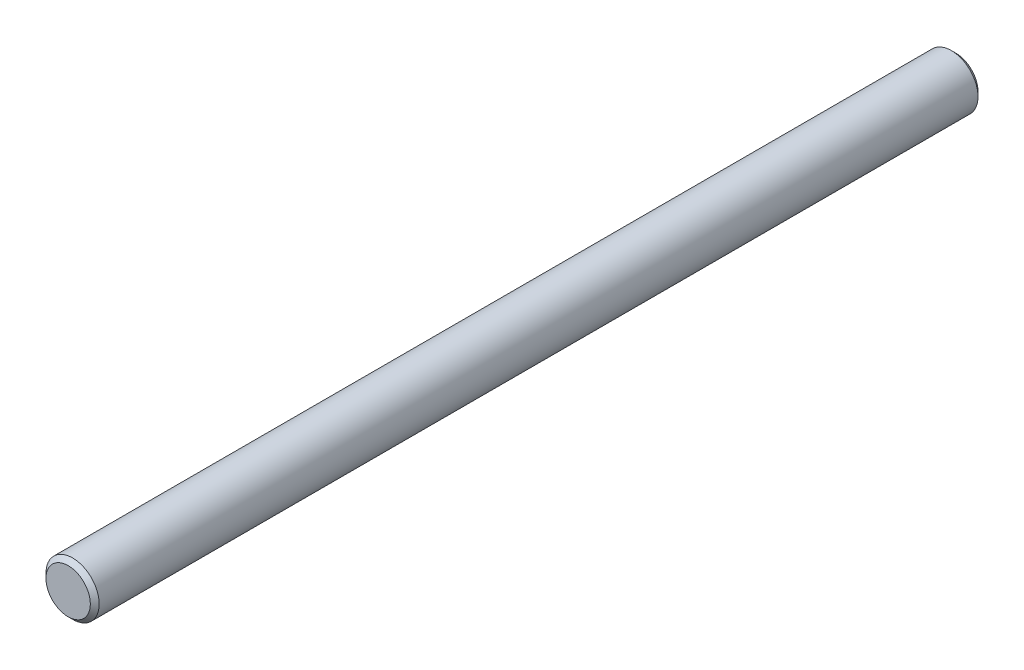
ISO-10303-21;
HEADER;
FILE_DESCRIPTION(('STEP AP214'),'2;1');
FILE_NAME('part.step','',(''),(''),'','','');
FILE_SCHEMA(('AUTOMOTIVE_DESIGN { 1 0 10303 214 1 1 1 1 }'));
ENDSEC;
DATA;
#1=APPLICATION_CONTEXT('core data for automotive mechanical design processes');
#2=APPLICATION_PROTOCOL_DEFINITION('international standard','automotive_design',2000,#1);
#3=PRODUCT_CONTEXT('',#1,'mechanical');
#4=PRODUCT('Part','Part','',(#3));
#5=PRODUCT_RELATED_PRODUCT_CATEGORY('part','',(#4));
#6=PRODUCT_DEFINITION_FORMATION('','',#4);
#7=PRODUCT_DEFINITION_CONTEXT('part definition',#1,'design');
#8=PRODUCT_DEFINITION('design','',#6,#7);
#9=PRODUCT_DEFINITION_SHAPE('','',#8);
#10=(LENGTH_UNIT() NAMED_UNIT(*) SI_UNIT(.MILLI.,.METRE.));
#11=(NAMED_UNIT(*) PLANE_ANGLE_UNIT() SI_UNIT($,.RADIAN.));
#12=(NAMED_UNIT(*) SI_UNIT($,.STERADIAN.) SOLID_ANGLE_UNIT());
#13=UNCERTAINTY_MEASURE_WITH_UNIT(LENGTH_MEASURE(1.E-05),#10,'distance_accuracy_value','');
#14=(GEOMETRIC_REPRESENTATION_CONTEXT(3) GLOBAL_UNCERTAINTY_ASSIGNED_CONTEXT((#13)) GLOBAL_UNIT_ASSIGNED_CONTEXT((#10,
#11,#12)) REPRESENTATION_CONTEXT('',''));
#15=CARTESIAN_POINT('',(0.,0.,0.));
#16=DIRECTION('',(0.,0.,1.));
#17=DIRECTION('',(1.,0.,0.));
#18=AXIS2_PLACEMENT_3D('',#15,#16,#17);
#19=CARTESIAN_POINT('',(0.,0.,100.));
#20=DIRECTION('',(0.,0.,-1.));
#21=DIRECTION('',(-1.,0.,0.));
#22=AXIS2_PLACEMENT_3D('',#19,#20,#21);
#23=CYLINDRICAL_SURFACE('',#22,3.);
#24=CARTESIAN_POINT('',(0.,0.,0.499999999999987));
#25=DIRECTION('',(0.,0.,1.));
#26=DIRECTION('',(1.,0.,0.));
#27=AXIS2_PLACEMENT_3D('',#24,#25,#26);
#28=CIRCLE('',#27,3.);
#29=CARTESIAN_POINT('',(3.,0.,0.499999999999987));
#30=VERTEX_POINT('',#29);
#31=EDGE_CURVE('E41',#30,#30,#28,.T.);
#32=ORIENTED_EDGE('',*,*,#31,.T.);
#33=EDGE_LOOP('',(#32));
#34=FACE_BOUND('',#33,.T.);
#35=CARTESIAN_POINT('',(0.,0.,99.5));
#36=DIRECTION('',(0.,0.,1.));
#37=DIRECTION('',(1.,0.,0.));
#38=AXIS2_PLACEMENT_3D('',#35,#36,#37);
#39=CIRCLE('',#38,3.);
#40=CARTESIAN_POINT('',(3.,0.,99.5));
#41=VERTEX_POINT('',#40);
#42=EDGE_CURVE('E45',#41,#41,#39,.F.);
#43=ORIENTED_EDGE('',*,*,#42,.T.);
#44=EDGE_LOOP('',(#43));
#45=FACE_BOUND('',#44,.T.);
#46=ADVANCED_FACE('F30',(#34,#45),#23,.T.);
#47=CARTESIAN_POINT('',(0.,0.,100.));
#48=DIRECTION('',(0.,0.,1.));
#49=DIRECTION('',(1.,0.,0.));
#50=AXIS2_PLACEMENT_3D('',#47,#48,#49);
#51=PLANE('',#50);
#52=CARTESIAN_POINT('',(0.,0.,100.));
#53=DIRECTION('',(0.,0.,1.));
#54=DIRECTION('',(1.,0.,0.));
#55=AXIS2_PLACEMENT_3D('',#52,#53,#54);
#56=CIRCLE('',#55,2.49999999999999);
#57=CARTESIAN_POINT('',(2.49999999999999,0.,100.));
#58=VERTEX_POINT('',#57);
#59=EDGE_CURVE('E10',#58,#58,#56,.T.);
#60=ORIENTED_EDGE('',*,*,#59,.T.);
#61=EDGE_LOOP('',(#60));
#62=FACE_BOUND('',#61,.T.);
#63=ADVANCED_FACE('F61',(#62),#51,.T.);
#64=CARTESIAN_POINT('',(0.,0.,0.));
#65=DIRECTION('',(0.,0.,1.));
#66=DIRECTION('',(1.,0.,0.));
#67=AXIS2_PLACEMENT_3D('',#64,#65,#66);
#68=PLANE('',#67);
#69=CARTESIAN_POINT('',(0.,0.,0.));
#70=DIRECTION('',(0.,0.,1.));
#71=DIRECTION('',(1.,0.,0.));
#72=AXIS2_PLACEMENT_3D('',#69,#70,#71);
#73=CIRCLE('',#72,2.50000000000002);
#74=CARTESIAN_POINT('',(2.50000000000002,0.,0.));
#75=VERTEX_POINT('',#74);
#76=EDGE_CURVE('E37',#75,#75,#73,.F.);
#77=ORIENTED_EDGE('',*,*,#76,.T.);
#78=EDGE_LOOP('',(#77));
#79=FACE_BOUND('',#78,.T.);
#80=ADVANCED_FACE('F58',(#79),#68,.F.);
#81=CARTESIAN_POINT('',(0.,0.,0.499999999999987));
#82=DIRECTION('',(0.,0.,1.));
#83=DIRECTION('',(1.,0.,0.));
#84=AXIS2_PLACEMENT_3D('',#81,#82,#83);
#85=CONICAL_SURFACE('',#84,3.,0.785398163397445);
#86=ORIENTED_EDGE('',*,*,#76,.F.);
#87=EDGE_LOOP('',(#86));
#88=FACE_BOUND('',#87,.T.);
#89=ORIENTED_EDGE('',*,*,#31,.F.);
#90=EDGE_LOOP('',(#89));
#91=FACE_BOUND('',#90,.T.);
#92=ADVANCED_FACE('F54',(#88,#91),#85,.T.);
#93=CARTESIAN_POINT('',(0.,0.,100.));
#94=DIRECTION('',(0.,0.,-1.));
#95=DIRECTION('',(-1.,0.,0.));
#96=AXIS2_PLACEMENT_3D('',#93,#94,#95);
#97=CONICAL_SURFACE('',#96,2.49999999999999,0.785398163397459);
#98=ORIENTED_EDGE('',*,*,#42,.F.);
#99=EDGE_LOOP('',(#98));
#100=FACE_BOUND('',#99,.T.);
#101=ORIENTED_EDGE('',*,*,#59,.F.);
#102=EDGE_LOOP('',(#101));
#103=FACE_BOUND('',#102,.T.);
#104=ADVANCED_FACE('F32',(#100,#103),#97,.T.);
#105=CLOSED_SHELL('',(#46,#63,#80,#92,#104));
#106=MANIFOLD_SOLID_BREP('B2',#105);
#107=ADVANCED_BREP_SHAPE_REPRESENTATION('',(#18,#106),#14);
#108=SHAPE_DEFINITION_REPRESENTATION(#9,#107);
ENDSEC;
END-ISO-10303-21;
